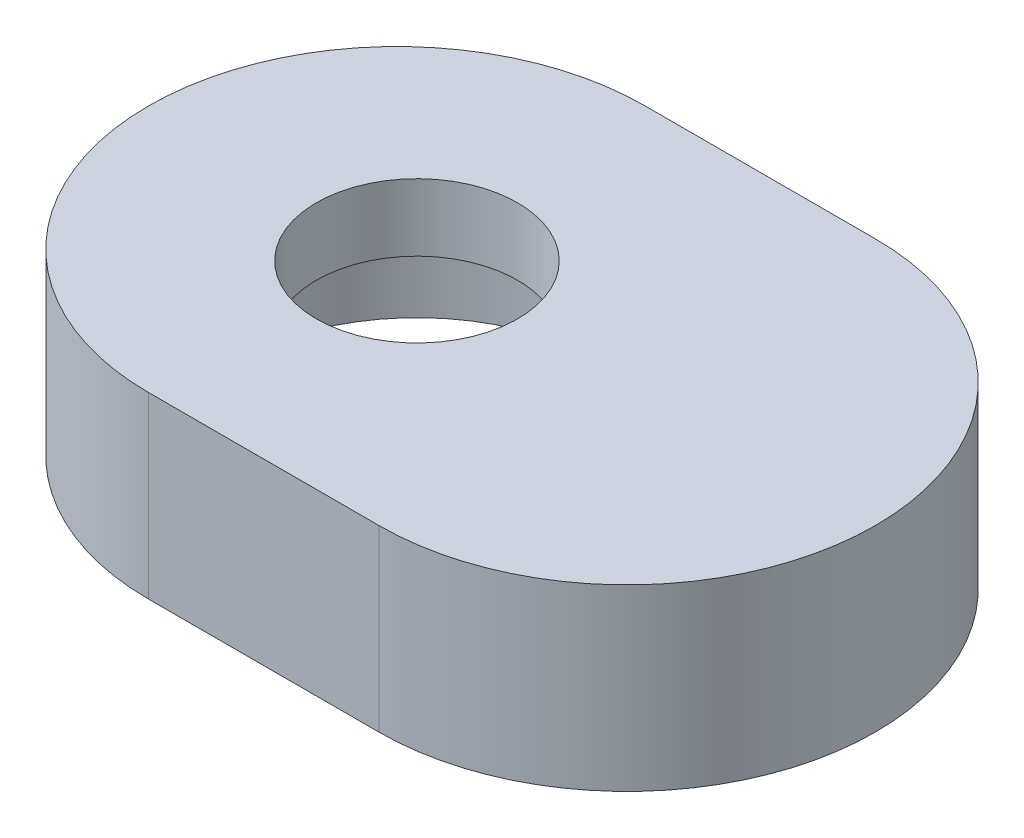
ISO-10303-21;
HEADER;
FILE_DESCRIPTION(('STEP AP214'),'2;1');
FILE_NAME('part.step','',(''),(''),'','','');
FILE_SCHEMA(('AUTOMOTIVE_DESIGN { 1 0 10303 214 1 1 1 1 }'));
ENDSEC;
DATA;
#1=APPLICATION_CONTEXT('core data for automotive mechanical design processes');
#2=APPLICATION_PROTOCOL_DEFINITION('international standard','automotive_design',2000,#1);
#3=PRODUCT_CONTEXT('',#1,'mechanical');
#4=PRODUCT('Part','Part','',(#3));
#5=PRODUCT_RELATED_PRODUCT_CATEGORY('part','',(#4));
#6=PRODUCT_DEFINITION_FORMATION('','',#4);
#7=PRODUCT_DEFINITION_CONTEXT('part definition',#1,'design');
#8=PRODUCT_DEFINITION('design','',#6,#7);
#9=PRODUCT_DEFINITION_SHAPE('','',#8);
#10=(LENGTH_UNIT() NAMED_UNIT(*) SI_UNIT(.MILLI.,.METRE.));
#11=(NAMED_UNIT(*) PLANE_ANGLE_UNIT() SI_UNIT($,.RADIAN.));
#12=(NAMED_UNIT(*) SI_UNIT($,.STERADIAN.) SOLID_ANGLE_UNIT());
#13=UNCERTAINTY_MEASURE_WITH_UNIT(LENGTH_MEASURE(1.E-05),#10,'distance_accuracy_value','');
#14=(GEOMETRIC_REPRESENTATION_CONTEXT(3) GLOBAL_UNCERTAINTY_ASSIGNED_CONTEXT((#13)) GLOBAL_UNIT_ASSIGNED_CONTEXT((#10,
#11,#12)) REPRESENTATION_CONTEXT('',''));
#15=CARTESIAN_POINT('',(0.,0.,0.));
#16=DIRECTION('',(0.,0.,1.));
#17=DIRECTION('',(1.,0.,0.));
#18=AXIS2_PLACEMENT_3D('',#15,#16,#17);
#19=CARTESIAN_POINT('',(0.9,8.,0.));
#20=DIRECTION('',(0.,-1.,0.));
#21=DIRECTION('',(0.,0.,-1.));
#22=AXIS2_PLACEMENT_3D('',#19,#20,#21);
#23=CYLINDRICAL_SURFACE('',#22,8.2);
#24=CARTESIAN_POINT('',(0.9,0.,0.));
#25=DIRECTION('',(0.,1.,0.));
#26=DIRECTION('',(0.,0.,1.));
#27=AXIS2_PLACEMENT_3D('',#24,#25,#26);
#28=CIRCLE('',#27,8.2);
#29=CARTESIAN_POINT('',(0.9,0.,8.2));
#30=VERTEX_POINT('',#29);
#31=EDGE_CURVE('E103',#30,#30,#28,.T.);
#32=ORIENTED_EDGE('',*,*,#31,.F.);
#33=EDGE_LOOP('',(#32));
#34=FACE_BOUND('',#33,.T.);
#35=CARTESIAN_POINT('',(0.9,5.,0.));
#36=DIRECTION('',(0.,1.,0.));
#37=DIRECTION('',(0.,0.,1.));
#38=AXIS2_PLACEMENT_3D('',#35,#36,#37);
#39=CIRCLE('',#38,8.2);
#40=CARTESIAN_POINT('',(0.9,5.,8.2));
#41=VERTEX_POINT('',#40);
#42=EDGE_CURVE('E117',#41,#41,#39,.T.);
#43=ORIENTED_EDGE('',*,*,#42,.T.);
#44=EDGE_LOOP('',(#43));
#45=FACE_BOUND('',#44,.T.);
#46=ADVANCED_FACE('F35',(#34,#45),#23,.F.);
#47=CARTESIAN_POINT('',(0.,8.,0.));
#48=DIRECTION('',(0.,1.,0.));
#49=DIRECTION('',(0.,0.,1.));
#50=AXIS2_PLACEMENT_3D('',#47,#48,#49);
#51=PLANE('',#50);
#52=CARTESIAN_POINT('',(0.,8.,0.));
#53=DIRECTION('',(0.,1.,0.));
#54=DIRECTION('',(0.,0.,1.));
#55=AXIS2_PLACEMENT_3D('',#52,#53,#54);
#56=CIRCLE('',#55,11.1);
#57=CARTESIAN_POINT('',(0.,8.,-11.1));
#58=VERTEX_POINT('',#57);
#59=CARTESIAN_POINT('',(0.,8.,11.1));
#60=VERTEX_POINT('',#59);
#61=EDGE_CURVE('E88',#58,#60,#56,.T.);
#62=ORIENTED_EDGE('',*,*,#61,.T.);
#63=DIRECTION('',(1.,0.,0.));
#64=VECTOR('',#63,1.);
#65=CARTESIAN_POINT('',(0.,8.,11.1));
#66=LINE('',#65,#64);
#67=CARTESIAN_POINT('',(10.3,8.,11.1));
#68=VERTEX_POINT('',#67);
#69=EDGE_CURVE('E82',#60,#68,#66,.T.);
#70=ORIENTED_EDGE('',*,*,#69,.T.);
#71=CARTESIAN_POINT('',(10.3,8.,0.));
#72=DIRECTION('',(0.,1.,0.));
#73=DIRECTION('',(0.,0.,1.));
#74=AXIS2_PLACEMENT_3D('',#71,#72,#73);
#75=CIRCLE('',#74,11.1);
#76=CARTESIAN_POINT('',(10.3,8.,-11.1));
#77=VERTEX_POINT('',#76);
#78=EDGE_CURVE('E86',#68,#77,#75,.T.);
#79=ORIENTED_EDGE('',*,*,#78,.T.);
#80=DIRECTION('',(-1.,0.,0.));
#81=VECTOR('',#80,1.);
#82=CARTESIAN_POINT('',(0.,8.,-11.1));
#83=LINE('',#82,#81);
#84=EDGE_CURVE('E52',#77,#58,#83,.T.);
#85=ORIENTED_EDGE('',*,*,#84,.T.);
#86=EDGE_LOOP('',(#62,#70,#79,#85));
#87=FACE_BOUND('',#86,.T.);
#88=CARTESIAN_POINT('',(0.9,8.,0.));
#89=DIRECTION('',(0.,1.,0.));
#90=DIRECTION('',(0.,0.,1.));
#91=AXIS2_PLACEMENT_3D('',#88,#89,#90);
#92=CIRCLE('',#91,4.5);
#93=CARTESIAN_POINT('',(0.9,8.,4.5));
#94=VERTEX_POINT('',#93);
#95=EDGE_CURVE('E121',#94,#94,#92,.T.);
#96=ORIENTED_EDGE('',*,*,#95,.F.);
#97=EDGE_LOOP('',(#96));
#98=FACE_BOUND('',#97,.T.);
#99=ADVANCED_FACE('F83',(#87,#98),#51,.T.);
#100=CARTESIAN_POINT('',(0.,0.,0.));
#101=DIRECTION('',(0.,1.,0.));
#102=DIRECTION('',(0.,0.,1.));
#103=AXIS2_PLACEMENT_3D('',#100,#101,#102);
#104=PLANE('',#103);
#105=CARTESIAN_POINT('',(0.,0.,0.));
#106=DIRECTION('',(0.,1.,0.));
#107=DIRECTION('',(0.,0.,1.));
#108=AXIS2_PLACEMENT_3D('',#105,#106,#107);
#109=CIRCLE('',#108,11.1);
#110=CARTESIAN_POINT('',(0.,0.,-11.1));
#111=VERTEX_POINT('',#110);
#112=CARTESIAN_POINT('',(0.,0.,11.1));
#113=VERTEX_POINT('',#112);
#114=EDGE_CURVE('E100',#111,#113,#109,.T.);
#115=ORIENTED_EDGE('',*,*,#114,.F.);
#116=DIRECTION('',(-1.,0.,0.));
#117=VECTOR('',#116,1.);
#118=CARTESIAN_POINT('',(0.,0.,-11.1));
#119=LINE('',#118,#117);
#120=CARTESIAN_POINT('',(10.3,0.,-11.1));
#121=VERTEX_POINT('',#120);
#122=EDGE_CURVE('E75',#121,#111,#119,.T.);
#123=ORIENTED_EDGE('',*,*,#122,.F.);
#124=CARTESIAN_POINT('',(10.3,0.,0.));
#125=DIRECTION('',(0.,1.,0.));
#126=DIRECTION('',(0.,0.,1.));
#127=AXIS2_PLACEMENT_3D('',#124,#125,#126);
#128=CIRCLE('',#127,11.1);
#129=CARTESIAN_POINT('',(10.3,0.,11.1));
#130=VERTEX_POINT('',#129);
#131=EDGE_CURVE('E69',#130,#121,#128,.T.);
#132=ORIENTED_EDGE('',*,*,#131,.F.);
#133=DIRECTION('',(1.,0.,0.));
#134=VECTOR('',#133,1.);
#135=CARTESIAN_POINT('',(0.,0.,11.1));
#136=LINE('',#135,#134);
#137=EDGE_CURVE('E92',#113,#130,#136,.T.);
#138=ORIENTED_EDGE('',*,*,#137,.F.);
#139=EDGE_LOOP('',(#115,#123,#132,#138));
#140=FACE_BOUND('',#139,.T.);
#141=ORIENTED_EDGE('',*,*,#31,.T.);
#142=EDGE_LOOP('',(#141));
#143=FACE_BOUND('',#142,.T.);
#144=ADVANCED_FACE('F111',(#140,#143),#104,.F.);
#145=CARTESIAN_POINT('',(0.,8.,0.));
#146=DIRECTION('',(0.,-1.,0.));
#147=DIRECTION('',(0.,0.,-1.));
#148=AXIS2_PLACEMENT_3D('',#145,#146,#147);
#149=CYLINDRICAL_SURFACE('',#148,11.1);
#150=ORIENTED_EDGE('',*,*,#114,.T.);
#151=DIRECTION('',(0.,-1.,0.));
#152=VECTOR('',#151,1.);
#153=CARTESIAN_POINT('',(0.,8.,11.1));
#154=LINE('',#153,#152);
#155=EDGE_CURVE('E11',#60,#113,#154,.T.);
#156=ORIENTED_EDGE('',*,*,#155,.F.);
#157=ORIENTED_EDGE('',*,*,#61,.F.);
#158=DIRECTION('',(0.,-1.,0.));
#159=VECTOR('',#158,1.);
#160=CARTESIAN_POINT('',(0.,8.,-11.1));
#161=LINE('',#160,#159);
#162=EDGE_CURVE('E96',#58,#111,#161,.T.);
#163=ORIENTED_EDGE('',*,*,#162,.T.);
#164=EDGE_LOOP('',(#150,#156,#157,#163));
#165=FACE_BOUND('',#164,.T.);
#166=ADVANCED_FACE('F37',(#165),#149,.T.);
#167=CARTESIAN_POINT('',(0.,8.,11.1));
#168=DIRECTION('',(0.,0.,-1.));
#169=DIRECTION('',(-1.,0.,0.));
#170=AXIS2_PLACEMENT_3D('',#167,#168,#169);
#171=PLANE('',#170);
#172=ORIENTED_EDGE('',*,*,#137,.T.);
#173=DIRECTION('',(0.,-1.,0.));
#174=VECTOR('',#173,1.);
#175=CARTESIAN_POINT('',(10.3,8.,11.1));
#176=LINE('',#175,#174);
#177=EDGE_CURVE('E44',#68,#130,#176,.T.);
#178=ORIENTED_EDGE('',*,*,#177,.F.);
#179=ORIENTED_EDGE('',*,*,#69,.F.);
#180=ORIENTED_EDGE('',*,*,#155,.T.);
#181=EDGE_LOOP('',(#172,#178,#179,#180));
#182=FACE_BOUND('',#181,.T.);
#183=ADVANCED_FACE('F91',(#182),#171,.F.);
#184=CARTESIAN_POINT('',(10.3,8.,0.));
#185=DIRECTION('',(0.,-1.,0.));
#186=DIRECTION('',(0.,0.,-1.));
#187=AXIS2_PLACEMENT_3D('',#184,#185,#186);
#188=CYLINDRICAL_SURFACE('',#187,11.1);
#189=ORIENTED_EDGE('',*,*,#131,.T.);
#190=DIRECTION('',(0.,-1.,0.));
#191=VECTOR('',#190,1.);
#192=CARTESIAN_POINT('',(10.3,8.,-11.1));
#193=LINE('',#192,#191);
#194=EDGE_CURVE('E93',#77,#121,#193,.T.);
#195=ORIENTED_EDGE('',*,*,#194,.F.);
#196=ORIENTED_EDGE('',*,*,#78,.F.);
#197=ORIENTED_EDGE('',*,*,#177,.T.);
#198=EDGE_LOOP('',(#189,#195,#196,#197));
#199=FACE_BOUND('',#198,.T.);
#200=ADVANCED_FACE('F94',(#199),#188,.T.);
#201=CARTESIAN_POINT('',(0.,8.,-11.1));
#202=DIRECTION('',(0.,0.,1.));
#203=DIRECTION('',(1.,0.,0.));
#204=AXIS2_PLACEMENT_3D('',#201,#202,#203);
#205=PLANE('',#204);
#206=ORIENTED_EDGE('',*,*,#122,.T.);
#207=ORIENTED_EDGE('',*,*,#162,.F.);
#208=ORIENTED_EDGE('',*,*,#84,.F.);
#209=ORIENTED_EDGE('',*,*,#194,.T.);
#210=EDGE_LOOP('',(#206,#207,#208,#209));
#211=FACE_BOUND('',#210,.T.);
#212=ADVANCED_FACE('F108',(#211),#205,.F.);
#213=CARTESIAN_POINT('',(0.9,5.,0.));
#214=DIRECTION('',(0.,1.,0.));
#215=DIRECTION('',(0.,0.,1.));
#216=AXIS2_PLACEMENT_3D('',#213,#214,#215);
#217=PLANE('',#216);
#218=CARTESIAN_POINT('',(0.9,5.,0.));
#219=DIRECTION('',(0.,1.,0.));
#220=DIRECTION('',(0.,0.,1.));
#221=AXIS2_PLACEMENT_3D('',#218,#219,#220);
#222=CIRCLE('',#221,4.5);
#223=CARTESIAN_POINT('',(0.9,5.,4.5));
#224=VERTEX_POINT('',#223);
#225=EDGE_CURVE('E120',#224,#224,#222,.T.);
#226=ORIENTED_EDGE('',*,*,#225,.T.);
#227=EDGE_LOOP('',(#226));
#228=FACE_BOUND('',#227,.T.);
#229=ORIENTED_EDGE('',*,*,#42,.F.);
#230=EDGE_LOOP('',(#229));
#231=FACE_BOUND('',#230,.T.);
#232=ADVANCED_FACE('F127',(#228,#231),#217,.F.);
#233=CARTESIAN_POINT('',(0.9,5.,0.));
#234=DIRECTION('',(0.,1.,0.));
#235=DIRECTION('',(0.,0.,1.));
#236=AXIS2_PLACEMENT_3D('',#233,#234,#235);
#237=CYLINDRICAL_SURFACE('',#236,4.5);
#238=ORIENTED_EDGE('',*,*,#225,.F.);
#239=EDGE_LOOP('',(#238));
#240=FACE_BOUND('',#239,.T.);
#241=ORIENTED_EDGE('',*,*,#95,.T.);
#242=EDGE_LOOP('',(#241));
#243=FACE_BOUND('',#242,.T.);
#244=ADVANCED_FACE('F130',(#240,#243),#237,.F.);
#245=CLOSED_SHELL('',(#46,#99,#144,#166,#183,#200,#212,#232,#244));
#246=MANIFOLD_SOLID_BREP('B2',#245);
#247=ADVANCED_BREP_SHAPE_REPRESENTATION('',(#18,#246),#14);
#248=SHAPE_DEFINITION_REPRESENTATION(#9,#247);
ENDSEC;
END-ISO-10303-21;
